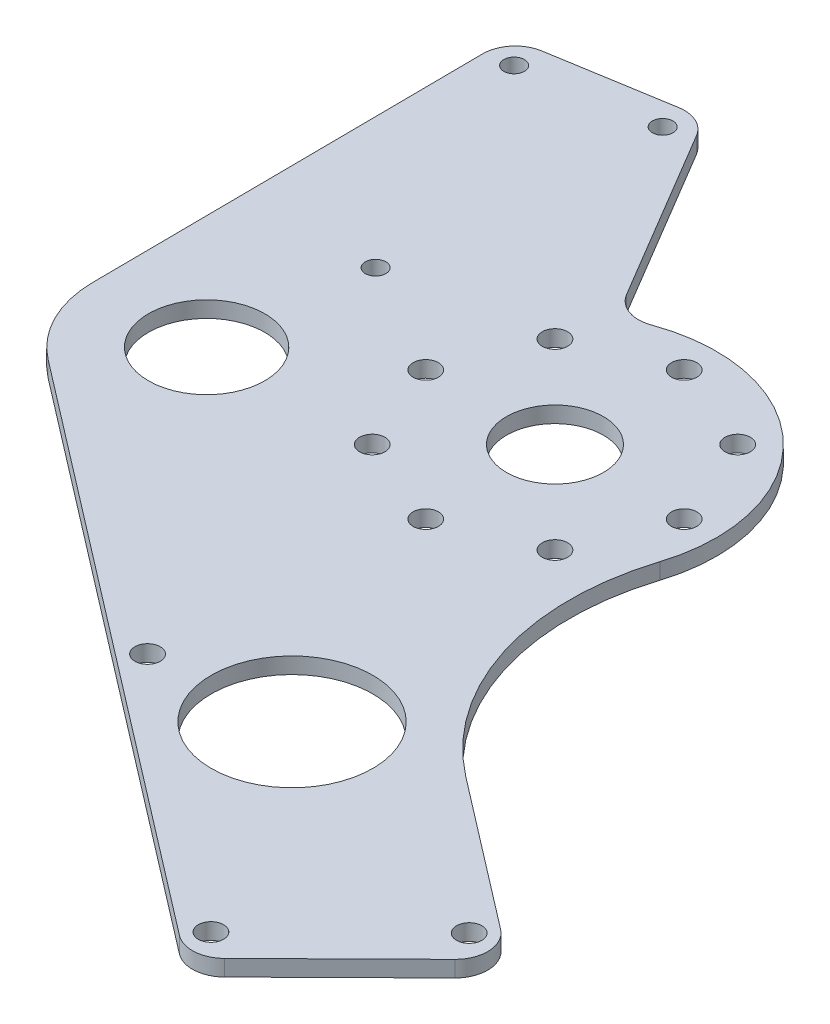
ISO-10303-21;
HEADER;
FILE_DESCRIPTION(('STEP AP214'),'2;1');
FILE_NAME('part.step','',(''),(''),'','','');
FILE_SCHEMA(('AUTOMOTIVE_DESIGN { 1 0 10303 214 1 1 1 1 }'));
ENDSEC;
DATA;
#1=APPLICATION_CONTEXT('core data for automotive mechanical design processes');
#2=APPLICATION_PROTOCOL_DEFINITION('international standard','automotive_design',2000,#1);
#3=PRODUCT_CONTEXT('',#1,'mechanical');
#4=PRODUCT('Part','Part','',(#3));
#5=PRODUCT_RELATED_PRODUCT_CATEGORY('part','',(#4));
#6=PRODUCT_DEFINITION_FORMATION('','',#4);
#7=PRODUCT_DEFINITION_CONTEXT('part definition',#1,'design');
#8=PRODUCT_DEFINITION('design','',#6,#7);
#9=PRODUCT_DEFINITION_SHAPE('','',#8);
#10=(LENGTH_UNIT() NAMED_UNIT(*) SI_UNIT(.MILLI.,.METRE.));
#11=(NAMED_UNIT(*) PLANE_ANGLE_UNIT() SI_UNIT($,.RADIAN.));
#12=(NAMED_UNIT(*) SI_UNIT($,.STERADIAN.) SOLID_ANGLE_UNIT());
#13=UNCERTAINTY_MEASURE_WITH_UNIT(LENGTH_MEASURE(1.E-05),#10,'distance_accuracy_value','');
#14=(GEOMETRIC_REPRESENTATION_CONTEXT(3) GLOBAL_UNCERTAINTY_ASSIGNED_CONTEXT((#13)) GLOBAL_UNIT_ASSIGNED_CONTEXT((#10,
#11,#12)) REPRESENTATION_CONTEXT('',''));
#15=CARTESIAN_POINT('',(0.,0.,0.));
#16=DIRECTION('',(0.,0.,1.));
#17=DIRECTION('',(1.,0.,0.));
#18=AXIS2_PLACEMENT_3D('',#15,#16,#17);
#19=CARTESIAN_POINT('',(418.465604345526,3.175,-3.2339030735739));
#20=DIRECTION('',(-0.999970140329143,0.,0.00772777135494843));
#21=DIRECTION('',(0.00772777135494843,0.,0.999970140329143));
#22=AXIS2_PLACEMENT_3D('',#19,#20,#21);
#23=PLANE('',#22);
#24=DIRECTION('',(-0.00772777135494843,0.,-0.999970140329143));
#25=VECTOR('',#24,1.);
#26=CARTESIAN_POINT('',(418.465604345526,0.,-3.2339030735739));
#27=LINE('',#26,#25);
#28=CARTESIAN_POINT('',(408.5011770715,0.,-1292.62631413742));
#29=VERTEX_POINT('',#28);
#30=CARTESIAN_POINT('',(407.904226499624,0.,-1369.87144985773));
#31=VERTEX_POINT('',#30);
#32=EDGE_CURVE('E145',#29,#31,#27,.T.);
#33=ORIENTED_EDGE('',*,*,#32,.F.);
#34=DIRECTION('',(0.,-1.,0.));
#35=VECTOR('',#34,1.);
#36=CARTESIAN_POINT('',(408.5011770715,3.175,-1292.62631413742));
#37=LINE('',#36,#35);
#38=CARTESIAN_POINT('',(408.5011770715,3.175,-1292.62631413742));
#39=VERTEX_POINT('',#38);
#40=EDGE_CURVE('E140',#39,#29,#37,.T.);
#41=ORIENTED_EDGE('',*,*,#40,.F.);
#42=DIRECTION('',(-0.00772777135494843,0.,-0.999970140329143));
#43=VECTOR('',#42,1.);
#44=CARTESIAN_POINT('',(418.465604345526,3.175,-3.2339030735739));
#45=LINE('',#44,#43);
#46=CARTESIAN_POINT('',(407.904226499624,3.175,-1369.87144985773));
#47=VERTEX_POINT('',#46);
#48=EDGE_CURVE('E143',#39,#47,#45,.T.);
#49=ORIENTED_EDGE('',*,*,#48,.T.);
#50=DIRECTION('',(0.,-1.,0.));
#51=VECTOR('',#50,1.);
#52=CARTESIAN_POINT('',(407.904226499624,3.175,-1369.87144985773));
#53=LINE('',#52,#51);
#54=EDGE_CURVE('E240',#47,#31,#53,.T.);
#55=ORIENTED_EDGE('',*,*,#54,.T.);
#56=EDGE_LOOP('',(#33,#41,#49,#55));
#57=FACE_BOUND('',#56,.T.);
#58=ADVANCED_FACE('F37',(#57),#23,.T.);
#59=CARTESIAN_POINT('',(430.725513440315,3.175,-1292.79806385579));
#60=DIRECTION('',(0.,-1.,0.));
#61=DIRECTION('',(0.,0.,-1.));
#62=AXIS2_PLACEMENT_3D('',#59,#60,#61);
#63=CYLINDRICAL_SURFACE('',#62,22.2249999999998);
#64=CARTESIAN_POINT('',(430.725513440315,0.,-1292.79806385579));
#65=DIRECTION('',(0.,1.,0.));
#66=DIRECTION('',(0.,0.,1.));
#67=AXIS2_PLACEMENT_3D('',#64,#65,#66);
#68=CIRCLE('',#67,22.2249999999998);
#69=CARTESIAN_POINT('',(417.195790680597,0.,-1275.16578586781));
#70=VERTEX_POINT('',#69);
#71=EDGE_CURVE('E242',#29,#70,#68,.T.);
#72=ORIENTED_EDGE('',*,*,#71,.T.);
#73=DIRECTION('',(0.,-1.,0.));
#74=VECTOR('',#73,1.);
#75=CARTESIAN_POINT('',(417.195790680597,3.175,-1275.16578586781));
#76=LINE('',#75,#74);
#77=CARTESIAN_POINT('',(417.195790680597,3.175,-1275.16578586781));
#78=VERTEX_POINT('',#77);
#79=EDGE_CURVE('E149',#78,#70,#76,.T.);
#80=ORIENTED_EDGE('',*,*,#79,.F.);
#81=CARTESIAN_POINT('',(430.725513440315,3.175,-1292.79806385579));
#82=DIRECTION('',(0.,1.,0.));
#83=DIRECTION('',(0.,0.,1.));
#84=AXIS2_PLACEMENT_3D('',#81,#82,#83);
#85=CIRCLE('',#84,22.2249999999998);
#86=EDGE_CURVE('E152',#39,#78,#85,.T.);
#87=ORIENTED_EDGE('',*,*,#86,.F.);
#88=ORIENTED_EDGE('',*,*,#40,.T.);
#89=EDGE_LOOP('',(#72,#80,#87,#88));
#90=FACE_BOUND('',#89,.T.);
#91=ADVANCED_FACE('F153',(#90),#63,.T.);
#92=CARTESIAN_POINT('',(770.466569942881,3.175,-1004.09158287551));
#93=DIRECTION('',(0.608761429008716,0.,-0.793353340291239));
#94=DIRECTION('',(-0.793353340291239,0.,-0.608761429008716));
#95=AXIS2_PLACEMENT_3D('',#92,#93,#94);
#96=PLANE('',#95);
#97=DIRECTION('',(0.793353340291239,0.,0.608761429008716));
#98=VECTOR('',#97,1.);
#99=CARTESIAN_POINT('',(770.466569942881,0.,-1004.09158287551));
#100=LINE('',#99,#98);
#101=CARTESIAN_POINT('',(528.200725869767,0.,-1189.98870329831));
#102=VERTEX_POINT('',#101);
#103=EDGE_CURVE('E245',#70,#102,#100,.T.);
#104=ORIENTED_EDGE('',*,*,#103,.T.);
#105=DIRECTION('',(0.,-1.,0.));
#106=VECTOR('',#105,1.);
#107=CARTESIAN_POINT('',(528.200725869767,3.175,-1189.98870329831));
#108=LINE('',#107,#106);
#109=CARTESIAN_POINT('',(528.200725869767,3.175,-1189.98870329831));
#110=VERTEX_POINT('',#109);
#111=EDGE_CURVE('E52',#102,#110,#108,.F.);
#112=ORIENTED_EDGE('',*,*,#111,.T.);
#113=DIRECTION('',(0.793353340291239,0.,0.608761429008716));
#114=VECTOR('',#113,1.);
#115=CARTESIAN_POINT('',(770.466569942881,3.175,-1004.09158287551));
#116=LINE('',#115,#114);
#117=EDGE_CURVE('E155',#78,#110,#116,.T.);
#118=ORIENTED_EDGE('',*,*,#117,.F.);
#119=ORIENTED_EDGE('',*,*,#79,.T.);
#120=EDGE_LOOP('',(#104,#112,#118,#119));
#121=FACE_BOUND('',#120,.T.);
#122=ADVANCED_FACE('F377',(#121),#96,.F.);
#123=CARTESIAN_POINT('',(-330.714425739165,3.175,-335.412196398918));
#124=DIRECTION('',(0.702102543692192,0.,0.712075851395729));
#125=DIRECTION('',(0.712075851395729,0.,-0.702102543692192));
#126=AXIS2_PLACEMENT_3D('',#123,#124,#125);
#127=PLANE('',#126);
#128=DIRECTION('',(-0.712075851395729,0.,0.702102543692193));
#129=VECTOR('',#128,1.);
#130=CARTESIAN_POINT('',(-330.714425739165,0.,-335.412196398918));
#131=LINE('',#130,#129);
#132=CARTESIAN_POINT('',(559.349966892476,0.,-1213.01038048511));
#133=VERTEX_POINT('',#132);
#134=CARTESIAN_POINT('',(536.524712096418,0.,-1190.5048153528));
#135=VERTEX_POINT('',#134);
#136=EDGE_CURVE('E247',#133,#135,#131,.T.);
#137=ORIENTED_EDGE('',*,*,#136,.F.);
#138=DIRECTION('',(0.,-1.,0.));
#139=VECTOR('',#138,1.);
#140=CARTESIAN_POINT('',(559.349966892476,3.175,-1213.01038048511));
#141=LINE('',#140,#139);
#142=CARTESIAN_POINT('',(559.349966892476,3.175,-1213.01038048511));
#143=VERTEX_POINT('',#142);
#144=EDGE_CURVE('E341',#133,#143,#141,.F.);
#145=ORIENTED_EDGE('',*,*,#144,.T.);
#146=DIRECTION('',(-0.712075851395729,0.,0.702102543692193));
#147=VECTOR('',#146,1.);
#148=CARTESIAN_POINT('',(-330.714425739165,3.175,-335.412196398918));
#149=LINE('',#148,#147);
#150=CARTESIAN_POINT('',(536.524712096418,3.175,-1190.5048153528));
#151=VERTEX_POINT('',#150);
#152=EDGE_CURVE('E173',#143,#151,#149,.T.);
#153=ORIENTED_EDGE('',*,*,#152,.T.);
#154=DIRECTION('',(0.,-1.,0.));
#155=VECTOR('',#154,1.);
#156=CARTESIAN_POINT('',(536.524712096418,0.,-1190.5048153528));
#157=LINE('',#156,#155);
#158=EDGE_CURVE('E338',#151,#135,#157,.T.);
#159=ORIENTED_EDGE('',*,*,#158,.T.);
#160=EDGE_LOOP('',(#137,#145,#153,#159));
#161=FACE_BOUND('',#160,.T.);
#162=ADVANCED_FACE('F382',(#161),#127,.T.);
#163=CARTESIAN_POINT('',(797.52601546232,3.175,-1039.35613885145));
#164=DIRECTION('',(-0.608761429008717,0.,0.793353340291238));
#165=DIRECTION('',(0.793353340291238,0.,0.608761429008717));
#166=AXIS2_PLACEMENT_3D('',#163,#164,#165);
#167=PLANE('',#166);
#168=DIRECTION('',(-0.793353340291238,0.,-0.608761429008717));
#169=VECTOR('',#168,1.);
#170=CARTESIAN_POINT('',(797.52601546232,3.175,-1039.35613885145));
#171=LINE('',#170,#169);
#172=CARTESIAN_POINT('',(558.757250814236,3.175,-1222.56985585232));
#173=VERTEX_POINT('',#172);
#174=CARTESIAN_POINT('',(529.278223979337,3.175,-1245.1899087221));
#175=VERTEX_POINT('',#174);
#176=EDGE_CURVE('E175',#173,#175,#171,.T.);
#177=ORIENTED_EDGE('',*,*,#176,.F.);
#178=DIRECTION('',(0.,-1.,0.));
#179=VECTOR('',#178,1.);
#180=CARTESIAN_POINT('',(558.757250814236,0.,-1222.56985585232));
#181=LINE('',#180,#179);
#182=CARTESIAN_POINT('',(558.757250814236,0.,-1222.56985585232));
#183=VERTEX_POINT('',#182);
#184=EDGE_CURVE('E331',#173,#183,#181,.T.);
#185=ORIENTED_EDGE('',*,*,#184,.T.);
#186=DIRECTION('',(-0.793353340291238,0.,-0.608761429008717));
#187=VECTOR('',#186,1.);
#188=CARTESIAN_POINT('',(797.52601546232,0.,-1039.35613885145));
#189=LINE('',#188,#187);
#190=CARTESIAN_POINT('',(529.278223979337,0.,-1245.1899087221));
#191=VERTEX_POINT('',#190);
#192=EDGE_CURVE('E250',#183,#191,#189,.T.);
#193=ORIENTED_EDGE('',*,*,#192,.T.);
#194=DIRECTION('',(0.,-1.,0.));
#195=VECTOR('',#194,1.);
#196=CARTESIAN_POINT('',(529.278223979337,3.175,-1245.1899087221));
#197=LINE('',#196,#195);
#198=EDGE_CURVE('E323',#175,#191,#197,.T.);
#199=ORIENTED_EDGE('',*,*,#198,.F.);
#200=EDGE_LOOP('',(#177,#185,#193,#199));
#201=FACE_BOUND('',#200,.T.);
#202=ADVANCED_FACE('F390',(#201),#167,.F.);
#203=CARTESIAN_POINT('',(560.20330457298,3.175,-1285.49225840889));
#204=DIRECTION('',(0.,-1.,0.));
#205=DIRECTION('',(0.,0.,-1.));
#206=AXIS2_PLACEMENT_3D('',#203,#204,#205);
#207=CYLINDRICAL_SURFACE('',#206,50.8);
#208=CARTESIAN_POINT('',(560.20330457298,0.,-1285.49225840889));
#209=DIRECTION('',(0.,1.,0.));
#210=DIRECTION('',(0.,0.,1.));
#211=AXIS2_PLACEMENT_3D('',#208,#209,#210);
#212=CIRCLE('',#211,50.8);
#213=CARTESIAN_POINT('',(511.786202337494,0.,-1300.86835060159));
#214=VERTEX_POINT('',#213);
#215=EDGE_CURVE('E252',#214,#191,#212,.T.);
#216=ORIENTED_EDGE('',*,*,#215,.F.);
#217=DIRECTION('',(0.,-1.,0.));
#218=VECTOR('',#217,1.);
#219=CARTESIAN_POINT('',(511.786202337494,3.175,-1300.86835060159));
#220=LINE('',#219,#218);
#221=CARTESIAN_POINT('',(511.786202337494,3.175,-1300.86835060159));
#222=VERTEX_POINT('',#221);
#223=EDGE_CURVE('E321',#222,#214,#220,.T.);
#224=ORIENTED_EDGE('',*,*,#223,.F.);
#225=CARTESIAN_POINT('',(560.20330457298,3.175,-1285.49225840889));
#226=DIRECTION('',(0.,1.,0.));
#227=DIRECTION('',(0.,0.,1.));
#228=AXIS2_PLACEMENT_3D('',#225,#226,#227);
#229=CIRCLE('',#228,50.8);
#230=EDGE_CURVE('E177',#222,#175,#229,.T.);
#231=ORIENTED_EDGE('',*,*,#230,.T.);
#232=ORIENTED_EDGE('',*,*,#198,.T.);
#233=EDGE_LOOP('',(#216,#224,#231,#232));
#234=FACE_BOUND('',#233,.T.);
#235=ADVANCED_FACE('F393',(#234),#207,.F.);
#236=CARTESIAN_POINT('',(481.525513440315,3.175,-1310.47840822203));
#237=DIRECTION('',(0.,-1.,0.));
#238=DIRECTION('',(0.,0.,-1.));
#239=AXIS2_PLACEMENT_3D('',#236,#237,#238);
#240=CYLINDRICAL_SURFACE('',#239,31.75);
#241=CARTESIAN_POINT('',(481.525513440315,0.,-1310.47840822203));
#242=DIRECTION('',(0.,1.,0.));
#243=DIRECTION('',(0.,0.,1.));
#244=AXIS2_PLACEMENT_3D('',#241,#242,#243);
#245=CIRCLE('',#244,31.75);
#246=CARTESIAN_POINT('',(470.66528430172,0.,-1340.31325233185));
#247=VERTEX_POINT('',#246);
#248=EDGE_CURVE('E255',#214,#247,#245,.T.);
#249=ORIENTED_EDGE('',*,*,#248,.T.);
#250=DIRECTION('',(0.,-1.,0.));
#251=VECTOR('',#250,1.);
#252=CARTESIAN_POINT('',(470.66528430172,3.175,-1340.31325233185));
#253=LINE('',#252,#251);
#254=CARTESIAN_POINT('',(470.66528430172,3.175,-1340.31325233185));
#255=VERTEX_POINT('',#254);
#256=EDGE_CURVE('E329',#247,#255,#253,.F.);
#257=ORIENTED_EDGE('',*,*,#256,.T.);
#258=CARTESIAN_POINT('',(481.525513440315,3.175,-1310.47840822203));
#259=DIRECTION('',(0.,1.,0.));
#260=DIRECTION('',(0.,0.,1.));
#261=AXIS2_PLACEMENT_3D('',#258,#259,#260);
#262=CIRCLE('',#261,31.75);
#263=EDGE_CURVE('E180',#222,#255,#262,.T.);
#264=ORIENTED_EDGE('',*,*,#263,.F.);
#265=ORIENTED_EDGE('',*,*,#223,.T.);
#266=EDGE_LOOP('',(#249,#257,#264,#265));
#267=FACE_BOUND('',#266,.T.);
#268=ADVANCED_FACE('F358',(#267),#240,.T.);
#269=CARTESIAN_POINT('',(932.069584050088,3.175,-554.201701845273));
#270=DIRECTION('',(0.859536631227861,0.,-0.5110741429357));
#271=DIRECTION('',(-0.5110741429357,0.,-0.859536631227861));
#272=AXIS2_PLACEMENT_3D('',#269,#270,#271);
#273=PLANE('',#272);
#274=DIRECTION('',(0.5110741429357,0.,0.859536631227861));
#275=VECTOR('',#274,1.);
#276=CARTESIAN_POINT('',(932.069584050088,3.175,-554.201701845273));
#277=LINE('',#276,#275);
#278=CARTESIAN_POINT('',(442.845023811934,3.175,-1376.99118598073));
#279=VERTEX_POINT('',#278);
#280=CARTESIAN_POINT('',(463.035180865704,3.175,-1343.03490034618));
#281=VERTEX_POINT('',#280);
#282=EDGE_CURVE('E183',#279,#281,#277,.T.);
#283=ORIENTED_EDGE('',*,*,#282,.T.);
#284=DIRECTION('',(0.,-1.,0.));
#285=VECTOR('',#284,1.);
#286=CARTESIAN_POINT('',(463.035180865704,3.175,-1343.03490034617));
#287=LINE('',#286,#285);
#288=CARTESIAN_POINT('',(463.035180865704,0.,-1343.03490034618));
#289=VERTEX_POINT('',#288);
#290=EDGE_CURVE('E148',#281,#289,#287,.T.);
#291=ORIENTED_EDGE('',*,*,#290,.T.);
#292=DIRECTION('',(0.5110741429357,0.,0.859536631227861));
#293=VECTOR('',#292,1.);
#294=CARTESIAN_POINT('',(932.069584050088,0.,-554.201701845273));
#295=LINE('',#294,#293);
#296=CARTESIAN_POINT('',(442.845023811934,0.,-1376.99118598073));
#297=VERTEX_POINT('',#296);
#298=EDGE_CURVE('E258',#297,#289,#295,.T.);
#299=ORIENTED_EDGE('',*,*,#298,.F.);
#300=DIRECTION('',(0.,-1.,0.));
#301=VECTOR('',#300,1.);
#302=CARTESIAN_POINT('',(442.845023811934,3.175,-1376.99118598073));
#303=LINE('',#302,#301);
#304=EDGE_CURVE('E319',#279,#297,#303,.T.);
#305=ORIENTED_EDGE('',*,*,#304,.F.);
#306=EDGE_LOOP('',(#283,#291,#299,#305));
#307=FACE_BOUND('',#306,.T.);
#308=ADVANCED_FACE('F365',(#307),#273,.T.);
#309=CARTESIAN_POINT('',(437.386966203637,3.175,-1373.74586517309));
#310=DIRECTION('',(0.,-1.,0.));
#311=DIRECTION('',(0.,0.,-1.));
#312=AXIS2_PLACEMENT_3D('',#309,#310,#311);
#313=CYLINDRICAL_SURFACE('',#312,6.35000000000016);
#314=CARTESIAN_POINT('',(437.386966203637,0.,-1373.74586517309));
#315=DIRECTION('',(0.,1.,0.));
#316=DIRECTION('',(0.,0.,1.));
#317=AXIS2_PLACEMENT_3D('',#314,#315,#316);
#318=CIRCLE('',#317,6.35000000000016);
#319=CARTESIAN_POINT('',(436.350976576713,0.,-1380.01078540346));
#320=VERTEX_POINT('',#319);
#321=EDGE_CURVE('E261',#297,#320,#318,.T.);
#322=ORIENTED_EDGE('',*,*,#321,.T.);
#323=DIRECTION('',(0.,-1.,0.));
#324=VECTOR('',#323,1.);
#325=CARTESIAN_POINT('',(436.350976576713,3.175,-1380.01078540346));
#326=LINE('',#325,#324);
#327=CARTESIAN_POINT('',(436.350976576713,3.175,-1380.01078540346));
#328=VERTEX_POINT('',#327);
#329=EDGE_CURVE('E317',#328,#320,#326,.T.);
#330=ORIENTED_EDGE('',*,*,#329,.F.);
#331=CARTESIAN_POINT('',(437.386966203637,3.175,-1373.74586517309));
#332=DIRECTION('',(0.,1.,0.));
#333=DIRECTION('',(0.,0.,1.));
#334=AXIS2_PLACEMENT_3D('',#331,#332,#333);
#335=CIRCLE('',#334,6.35000000000016);
#336=EDGE_CURVE('E186',#279,#328,#335,.T.);
#337=ORIENTED_EDGE('',*,*,#336,.F.);
#338=ORIENTED_EDGE('',*,*,#304,.T.);
#339=EDGE_LOOP('',(#322,#330,#337,#338));
#340=FACE_BOUND('',#339,.T.);
#341=ADVANCED_FACE('F369',(#340),#313,.T.);
#342=CARTESIAN_POINT('',(-210.514901005292,3.175,-1273.04272922023));
#343=DIRECTION('',(-0.163147972743856,0.,-0.986601611081986));
#344=DIRECTION('',(-0.986601611081986,0.,0.163147972743856));
#345=AXIS2_PLACEMENT_3D('',#342,#343,#344);
#346=PLANE('',#345);
#347=DIRECTION('',(0.986601611081986,0.,-0.163147972743856));
#348=VECTOR('',#347,1.);
#349=CARTESIAN_POINT('',(-210.514901005292,0.,-1273.04272922023));
#350=LINE('',#349,#348);
#351=CARTESIAN_POINT('',(413.218047263791,0.,-1376.18544143621));
#352=VERTEX_POINT('',#351);
#353=EDGE_CURVE('E264',#352,#320,#350,.T.);
#354=ORIENTED_EDGE('',*,*,#353,.F.);
#355=DIRECTION('',(0.,-1.,0.));
#356=VECTOR('',#355,1.);
#357=CARTESIAN_POINT('',(413.218047263791,3.175,-1376.18544143621));
#358=LINE('',#357,#356);
#359=CARTESIAN_POINT('',(413.218047263791,3.175,-1376.18544143621));
#360=VERTEX_POINT('',#359);
#361=EDGE_CURVE('E315',#360,#352,#358,.T.);
#362=ORIENTED_EDGE('',*,*,#361,.F.);
#363=DIRECTION('',(0.986601611081986,0.,-0.163147972743856));
#364=VECTOR('',#363,1.);
#365=CARTESIAN_POINT('',(-210.514901005292,3.175,-1273.04272922023));
#366=LINE('',#365,#364);
#367=EDGE_CURVE('E188',#360,#328,#366,.T.);
#368=ORIENTED_EDGE('',*,*,#367,.T.);
#369=ORIENTED_EDGE('',*,*,#329,.T.);
#370=EDGE_LOOP('',(#354,#362,#368,#369));
#371=FACE_BOUND('',#370,.T.);
#372=ADVANCED_FACE('F372',(#371),#346,.T.);
#373=CARTESIAN_POINT('',(556.261131027794,3.175,-1218.88239604941));
#374=DIRECTION('',(0.,-1.,0.));
#375=DIRECTION('',(0.,0.,-1.));
#376=AXIS2_PLACEMENT_3D('',#373,#374,#375);
#377=CYLINDRICAL_SURFACE('',#376,2.48919999999997);
#378=CARTESIAN_POINT('',(556.261131027794,3.175,-1218.88239604941));
#379=DIRECTION('',(0.,1.,0.));
#380=DIRECTION('',(0.,0.,1.));
#381=AXIS2_PLACEMENT_3D('',#378,#379,#380);
#382=CIRCLE('',#381,2.48919999999997);
#383=CARTESIAN_POINT('',(556.261131027794,3.175,-1216.39319604941));
#384=VERTEX_POINT('',#383);
#385=EDGE_CURVE('E234',#384,#384,#382,.T.);
#386=ORIENTED_EDGE('',*,*,#385,.T.);
#387=EDGE_LOOP('',(#386));
#388=FACE_BOUND('',#387,.T.);
#389=CARTESIAN_POINT('',(556.261131027794,0.,-1218.88239604941));
#390=DIRECTION('',(0.,1.,0.));
#391=DIRECTION('',(0.,0.,1.));
#392=AXIS2_PLACEMENT_3D('',#389,#390,#391);
#393=CIRCLE('',#392,2.48919999999997);
#394=CARTESIAN_POINT('',(556.261131027794,0.,-1216.39319604941));
#395=VERTEX_POINT('',#394);
#396=EDGE_CURVE('E166',#395,#395,#393,.T.);
#397=ORIENTED_EDGE('',*,*,#396,.F.);
#398=EDGE_LOOP('',(#397));
#399=FACE_BOUND('',#398,.T.);
#400=ADVANCED_FACE('F436',(#388,#399),#377,.F.);
#401=CARTESIAN_POINT('',(477.144066858597,3.175,-1234.76865555389));
#402=DIRECTION('',(0.,-1.,0.));
#403=DIRECTION('',(0.,0.,-1.));
#404=AXIS2_PLACEMENT_3D('',#401,#402,#403);
#405=CYLINDRICAL_SURFACE('',#404,2.48920000000002);
#406=CARTESIAN_POINT('',(477.144066858597,3.175,-1234.76865555389));
#407=DIRECTION('',(0.,1.,0.));
#408=DIRECTION('',(0.,0.,1.));
#409=AXIS2_PLACEMENT_3D('',#406,#407,#408);
#410=CIRCLE('',#409,2.48920000000002);
#411=CARTESIAN_POINT('',(477.144066858597,3.175,-1232.27945555389));
#412=VERTEX_POINT('',#411);
#413=EDGE_CURVE('E231',#412,#412,#410,.T.);
#414=ORIENTED_EDGE('',*,*,#413,.T.);
#415=EDGE_LOOP('',(#414));
#416=FACE_BOUND('',#415,.T.);
#417=CARTESIAN_POINT('',(477.144066858597,0.,-1234.76865555389));
#418=DIRECTION('',(0.,1.,0.));
#419=DIRECTION('',(0.,0.,1.));
#420=AXIS2_PLACEMENT_3D('',#417,#418,#419);
#421=CIRCLE('',#420,2.48920000000002);
#422=CARTESIAN_POINT('',(477.144066858597,0.,-1232.27945555389));
#423=VERTEX_POINT('',#422);
#424=EDGE_CURVE('E309',#423,#423,#421,.T.);
#425=ORIENTED_EDGE('',*,*,#424,.F.);
#426=EDGE_LOOP('',(#425));
#427=FACE_BOUND('',#426,.T.);
#428=ADVANCED_FACE('F439',(#416,#427),#405,.F.);
#429=CARTESIAN_POINT('',(502.892129115102,3.175,-1237.42267201742));
#430=DIRECTION('',(0.,-1.,0.));
#431=DIRECTION('',(0.,0.,-1.));
#432=AXIS2_PLACEMENT_3D('',#429,#430,#431);
#433=CYLINDRICAL_SURFACE('',#432,15.875);
#434=CARTESIAN_POINT('',(502.892129115102,3.175,-1237.42267201742));
#435=DIRECTION('',(0.,1.,0.));
#436=DIRECTION('',(0.,0.,1.));
#437=AXIS2_PLACEMENT_3D('',#434,#435,#436);
#438=CIRCLE('',#437,15.875);
#439=CARTESIAN_POINT('',(502.892129115102,3.175,-1221.54767201742));
#440=VERTEX_POINT('',#439);
#441=EDGE_CURVE('E228',#440,#440,#438,.T.);
#442=ORIENTED_EDGE('',*,*,#441,.T.);
#443=EDGE_LOOP('',(#442));
#444=FACE_BOUND('',#443,.T.);
#445=CARTESIAN_POINT('',(502.892129115102,0.,-1237.42267201742));
#446=DIRECTION('',(0.,1.,0.));
#447=DIRECTION('',(0.,0.,1.));
#448=AXIS2_PLACEMENT_3D('',#445,#446,#447);
#449=CIRCLE('',#448,15.875);
#450=CARTESIAN_POINT('',(502.892129115102,0.,-1221.54767201742));
#451=VERTEX_POINT('',#450);
#452=EDGE_CURVE('E306',#451,#451,#449,.T.);
#453=ORIENTED_EDGE('',*,*,#452,.F.);
#454=EDGE_LOOP('',(#453));
#455=FACE_BOUND('',#454,.T.);
#456=ADVANCED_FACE('F443',(#444,#455),#433,.F.);
#457=CARTESIAN_POINT('',(430.725513440315,3.175,-1292.79806385579));
#458=DIRECTION('',(0.,-1.,0.));
#459=DIRECTION('',(0.,0.,-1.));
#460=AXIS2_PLACEMENT_3D('',#457,#458,#459);
#461=CYLINDRICAL_SURFACE('',#460,11.43);
#462=CARTESIAN_POINT('',(430.725513440315,3.175,-1292.79806385579));
#463=DIRECTION('',(0.,1.,0.));
#464=DIRECTION('',(0.,0.,1.));
#465=AXIS2_PLACEMENT_3D('',#462,#463,#464);
#466=CIRCLE('',#465,11.43);
#467=CARTESIAN_POINT('',(430.725513440315,3.175,-1281.36806385579));
#468=VERTEX_POINT('',#467);
#469=EDGE_CURVE('E225',#468,#468,#466,.T.);
#470=ORIENTED_EDGE('',*,*,#469,.T.);
#471=EDGE_LOOP('',(#470));
#472=FACE_BOUND('',#471,.T.);
#473=CARTESIAN_POINT('',(430.725513440315,0.,-1292.79806385579));
#474=DIRECTION('',(0.,1.,0.));
#475=DIRECTION('',(0.,0.,1.));
#476=AXIS2_PLACEMENT_3D('',#473,#474,#475);
#477=CIRCLE('',#476,11.43);
#478=CARTESIAN_POINT('',(430.725513440315,0.,-1281.36806385579));
#479=VERTEX_POINT('',#478);
#480=EDGE_CURVE('E303',#479,#479,#477,.T.);
#481=ORIENTED_EDGE('',*,*,#480,.F.);
#482=EDGE_LOOP('',(#481));
#483=FACE_BOUND('',#482,.T.);
#484=ADVANCED_FACE('F447',(#472,#483),#461,.F.);
#485=CARTESIAN_POINT('',(412.975684764623,3.175,-1370.99637536039));
#486=DIRECTION('',(0.,-1.,0.));
#487=DIRECTION('',(0.,0.,-1.));
#488=AXIS2_PLACEMENT_3D('',#485,#486,#487);
#489=CYLINDRICAL_SURFACE('',#488,2.01929999999989);
#490=CARTESIAN_POINT('',(412.975684764623,3.175,-1370.99637536039));
#491=DIRECTION('',(0.,1.,0.));
#492=DIRECTION('',(0.,0.,1.));
#493=AXIS2_PLACEMENT_3D('',#490,#491,#492);
#494=CIRCLE('',#493,2.01929999999989);
#495=CARTESIAN_POINT('',(412.975684764623,3.175,-1368.97707536039));
#496=VERTEX_POINT('',#495);
#497=EDGE_CURVE('E222',#496,#496,#494,.T.);
#498=ORIENTED_EDGE('',*,*,#497,.T.);
#499=EDGE_LOOP('',(#498));
#500=FACE_BOUND('',#499,.T.);
#501=CARTESIAN_POINT('',(412.975684764623,0.,-1370.99637536039));
#502=DIRECTION('',(0.,1.,0.));
#503=DIRECTION('',(0.,0.,1.));
#504=AXIS2_PLACEMENT_3D('',#501,#502,#503);
#505=CIRCLE('',#504,2.01929999999989);
#506=CARTESIAN_POINT('',(412.975684764623,0.,-1368.97707536039));
#507=VERTEX_POINT('',#506);
#508=EDGE_CURVE('E300',#507,#507,#505,.T.);
#509=ORIENTED_EDGE('',*,*,#508,.F.);
#510=EDGE_LOOP('',(#509));
#511=FACE_BOUND('',#510,.T.);
#512=ADVANCED_FACE('F451',(#500,#511),#489,.F.);
#513=CARTESIAN_POINT('',(438.035365686105,3.175,-1375.14033386809));
#514=DIRECTION('',(0.,-1.,0.));
#515=DIRECTION('',(0.,0.,-1.));
#516=AXIS2_PLACEMENT_3D('',#513,#514,#515);
#517=CYLINDRICAL_SURFACE('',#516,2.01929999999989);
#518=CARTESIAN_POINT('',(438.035365686105,3.175,-1375.14033386809));
#519=DIRECTION('',(0.,1.,0.));
#520=DIRECTION('',(0.,0.,1.));
#521=AXIS2_PLACEMENT_3D('',#518,#519,#520);
#522=CIRCLE('',#521,2.01929999999989);
#523=CARTESIAN_POINT('',(438.035365686105,3.175,-1373.12103386809));
#524=VERTEX_POINT('',#523);
#525=EDGE_CURVE('E219',#524,#524,#522,.T.);
#526=ORIENTED_EDGE('',*,*,#525,.T.);
#527=EDGE_LOOP('',(#526));
#528=FACE_BOUND('',#527,.T.);
#529=CARTESIAN_POINT('',(438.035365686105,0.,-1375.14033386809));
#530=DIRECTION('',(0.,1.,0.));
#531=DIRECTION('',(0.,0.,1.));
#532=AXIS2_PLACEMENT_3D('',#529,#530,#531);
#533=CIRCLE('',#532,2.01929999999989);
#534=CARTESIAN_POINT('',(438.035365686105,0.,-1373.12103386809));
#535=VERTEX_POINT('',#534);
#536=EDGE_CURVE('E297',#535,#535,#533,.T.);
#537=ORIENTED_EDGE('',*,*,#536,.F.);
#538=EDGE_LOOP('',(#537));
#539=FACE_BOUND('',#538,.T.);
#540=ADVANCED_FACE('F455',(#528,#539),#517,.F.);
#541=CARTESIAN_POINT('',(463.565001198177,3.175,-1328.43892046417));
#542=DIRECTION('',(0.,-1.,0.));
#543=DIRECTION('',(0.,0.,-1.));
#544=AXIS2_PLACEMENT_3D('',#541,#542,#543);
#545=CYLINDRICAL_SURFACE('',#544,2.48919999999964);
#546=CARTESIAN_POINT('',(463.565001198177,3.175,-1328.43892046417));
#547=DIRECTION('',(0.,1.,0.));
#548=DIRECTION('',(0.,0.,1.));
#549=AXIS2_PLACEMENT_3D('',#546,#547,#548);
#550=CIRCLE('',#549,2.48919999999964);
#551=CARTESIAN_POINT('',(463.565001198177,3.175,-1325.94972046417));
#552=VERTEX_POINT('',#551);
#553=EDGE_CURVE('E216',#552,#552,#550,.T.);
#554=ORIENTED_EDGE('',*,*,#553,.T.);
#555=EDGE_LOOP('',(#554));
#556=FACE_BOUND('',#555,.T.);
#557=CARTESIAN_POINT('',(463.565001198177,0.,-1328.43892046417));
#558=DIRECTION('',(0.,1.,0.));
#559=DIRECTION('',(0.,0.,1.));
#560=AXIS2_PLACEMENT_3D('',#557,#558,#559);
#561=CIRCLE('',#560,2.48919999999964);
#562=CARTESIAN_POINT('',(463.565001198177,0.,-1325.94972046417));
#563=VERTEX_POINT('',#562);
#564=EDGE_CURVE('E294',#563,#563,#561,.T.);
#565=ORIENTED_EDGE('',*,*,#564,.F.);
#566=EDGE_LOOP('',(#565));
#567=FACE_BOUND('',#566,.T.);
#568=ADVANCED_FACE('F459',(#556,#567),#545,.F.);
#569=CARTESIAN_POINT('',(481.525513440315,3.175,-1335.87840822203));
#570=DIRECTION('',(0.,-1.,0.));
#571=DIRECTION('',(0.,0.,-1.));
#572=AXIS2_PLACEMENT_3D('',#569,#570,#571);
#573=CYLINDRICAL_SURFACE('',#572,2.48920000000008);
#574=CARTESIAN_POINT('',(481.525513440315,3.175,-1335.87840822203));
#575=DIRECTION('',(0.,1.,0.));
#576=DIRECTION('',(0.,0.,1.));
#577=AXIS2_PLACEMENT_3D('',#574,#575,#576);
#578=CIRCLE('',#577,2.48920000000008);
#579=CARTESIAN_POINT('',(481.525513440315,3.175,-1333.38920822203));
#580=VERTEX_POINT('',#579);
#581=EDGE_CURVE('E213',#580,#580,#578,.T.);
#582=ORIENTED_EDGE('',*,*,#581,.T.);
#583=EDGE_LOOP('',(#582));
#584=FACE_BOUND('',#583,.T.);
#585=CARTESIAN_POINT('',(481.525513440315,0.,-1335.87840822203));
#586=DIRECTION('',(0.,1.,0.));
#587=DIRECTION('',(0.,0.,1.));
#588=AXIS2_PLACEMENT_3D('',#585,#586,#587);
#589=CIRCLE('',#588,2.48920000000008);
#590=CARTESIAN_POINT('',(481.525513440315,0.,-1333.38920822203));
#591=VERTEX_POINT('',#590);
#592=EDGE_CURVE('E291',#591,#591,#589,.T.);
#593=ORIENTED_EDGE('',*,*,#592,.F.);
#594=EDGE_LOOP('',(#593));
#595=FACE_BOUND('',#594,.T.);
#596=ADVANCED_FACE('F463',(#584,#595),#573,.F.);
#597=CARTESIAN_POINT('',(499.486025682454,3.175,-1328.43892046417));
#598=DIRECTION('',(0.,-1.,0.));
#599=DIRECTION('',(0.,0.,-1.));
#600=AXIS2_PLACEMENT_3D('',#597,#598,#599);
#601=CYLINDRICAL_SURFACE('',#600,2.48920000000008);
#602=CARTESIAN_POINT('',(499.486025682454,3.175,-1328.43892046417));
#603=DIRECTION('',(0.,1.,0.));
#604=DIRECTION('',(0.,0.,1.));
#605=AXIS2_PLACEMENT_3D('',#602,#603,#604);
#606=CIRCLE('',#605,2.48920000000008);
#607=CARTESIAN_POINT('',(499.486025682454,3.175,-1325.94972046417));
#608=VERTEX_POINT('',#607);
#609=EDGE_CURVE('E210',#608,#608,#606,.T.);
#610=ORIENTED_EDGE('',*,*,#609,.T.);
#611=EDGE_LOOP('',(#610));
#612=FACE_BOUND('',#611,.T.);
#613=CARTESIAN_POINT('',(499.486025682454,0.,-1328.43892046417));
#614=DIRECTION('',(0.,1.,0.));
#615=DIRECTION('',(0.,0.,1.));
#616=AXIS2_PLACEMENT_3D('',#613,#614,#615);
#617=CIRCLE('',#616,2.48920000000008);
#618=CARTESIAN_POINT('',(499.486025682454,0.,-1325.94972046417));
#619=VERTEX_POINT('',#618);
#620=EDGE_CURVE('E288',#619,#619,#617,.T.);
#621=ORIENTED_EDGE('',*,*,#620,.F.);
#622=EDGE_LOOP('',(#621));
#623=FACE_BOUND('',#622,.T.);
#624=ADVANCED_FACE('F467',(#612,#623),#601,.F.);
#625=CARTESIAN_POINT('',(506.925513440316,3.175,-1310.47840822203));
#626=DIRECTION('',(0.,-1.,0.));
#627=DIRECTION('',(0.,0.,-1.));
#628=AXIS2_PLACEMENT_3D('',#625,#626,#627);
#629=CYLINDRICAL_SURFACE('',#628,2.48920000000008);
#630=CARTESIAN_POINT('',(506.925513440316,3.175,-1310.47840822203));
#631=DIRECTION('',(0.,1.,0.));
#632=DIRECTION('',(0.,0.,1.));
#633=AXIS2_PLACEMENT_3D('',#630,#631,#632);
#634=CIRCLE('',#633,2.48920000000008);
#635=CARTESIAN_POINT('',(506.925513440316,3.175,-1307.98920822203));
#636=VERTEX_POINT('',#635);
#637=EDGE_CURVE('E207',#636,#636,#634,.T.);
#638=ORIENTED_EDGE('',*,*,#637,.T.);
#639=EDGE_LOOP('',(#638));
#640=FACE_BOUND('',#639,.T.);
#641=CARTESIAN_POINT('',(506.925513440316,0.,-1310.47840822203));
#642=DIRECTION('',(0.,1.,0.));
#643=DIRECTION('',(0.,0.,1.));
#644=AXIS2_PLACEMENT_3D('',#641,#642,#643);
#645=CIRCLE('',#644,2.48920000000008);
#646=CARTESIAN_POINT('',(506.925513440316,0.,-1307.98920822203));
#647=VERTEX_POINT('',#646);
#648=EDGE_CURVE('E285',#647,#647,#645,.T.);
#649=ORIENTED_EDGE('',*,*,#648,.F.);
#650=EDGE_LOOP('',(#649));
#651=FACE_BOUND('',#650,.T.);
#652=ADVANCED_FACE('F471',(#640,#651),#629,.F.);
#653=CARTESIAN_POINT('',(499.486025682454,3.175,-1292.5178959799));
#654=DIRECTION('',(0.,-1.,0.));
#655=DIRECTION('',(0.,0.,-1.));
#656=AXIS2_PLACEMENT_3D('',#653,#654,#655);
#657=CYLINDRICAL_SURFACE('',#656,2.48920000000008);
#658=CARTESIAN_POINT('',(499.486025682454,3.175,-1292.5178959799));
#659=DIRECTION('',(0.,1.,0.));
#660=DIRECTION('',(0.,0.,1.));
#661=AXIS2_PLACEMENT_3D('',#658,#659,#660);
#662=CIRCLE('',#661,2.48920000000008);
#663=CARTESIAN_POINT('',(499.486025682454,3.175,-1290.0286959799));
#664=VERTEX_POINT('',#663);
#665=EDGE_CURVE('E204',#664,#664,#662,.T.);
#666=ORIENTED_EDGE('',*,*,#665,.T.);
#667=EDGE_LOOP('',(#666));
#668=FACE_BOUND('',#667,.T.);
#669=CARTESIAN_POINT('',(499.486025682454,0.,-1292.5178959799));
#670=DIRECTION('',(0.,1.,0.));
#671=DIRECTION('',(0.,0.,1.));
#672=AXIS2_PLACEMENT_3D('',#669,#670,#671);
#673=CIRCLE('',#672,2.48920000000008);
#674=CARTESIAN_POINT('',(499.486025682454,0.,-1290.0286959799));
#675=VERTEX_POINT('',#674);
#676=EDGE_CURVE('E282',#675,#675,#673,.T.);
#677=ORIENTED_EDGE('',*,*,#676,.F.);
#678=EDGE_LOOP('',(#677));
#679=FACE_BOUND('',#678,.T.);
#680=ADVANCED_FACE('F475',(#668,#679),#657,.F.);
#681=CARTESIAN_POINT('',(481.525513440315,3.175,-1285.07840822203));
#682=DIRECTION('',(0.,-1.,0.));
#683=DIRECTION('',(0.,0.,-1.));
#684=AXIS2_PLACEMENT_3D('',#681,#682,#683);
#685=CYLINDRICAL_SURFACE('',#684,2.48920000000008);
#686=CARTESIAN_POINT('',(481.525513440315,3.175,-1285.07840822203));
#687=DIRECTION('',(0.,1.,0.));
#688=DIRECTION('',(0.,0.,1.));
#689=AXIS2_PLACEMENT_3D('',#686,#687,#688);
#690=CIRCLE('',#689,2.48920000000008);
#691=CARTESIAN_POINT('',(481.525513440315,3.175,-1282.58920822203));
#692=VERTEX_POINT('',#691);
#693=EDGE_CURVE('E201',#692,#692,#690,.T.);
#694=ORIENTED_EDGE('',*,*,#693,.T.);
#695=EDGE_LOOP('',(#694));
#696=FACE_BOUND('',#695,.T.);
#697=CARTESIAN_POINT('',(481.525513440315,0.,-1285.07840822203));
#698=DIRECTION('',(0.,1.,0.));
#699=DIRECTION('',(0.,0.,1.));
#700=AXIS2_PLACEMENT_3D('',#697,#698,#699);
#701=CIRCLE('',#700,2.48920000000008);
#702=CARTESIAN_POINT('',(481.525513440315,0.,-1282.58920822203));
#703=VERTEX_POINT('',#702);
#704=EDGE_CURVE('E279',#703,#703,#701,.T.);
#705=ORIENTED_EDGE('',*,*,#704,.F.);
#706=EDGE_LOOP('',(#705));
#707=FACE_BOUND('',#706,.T.);
#708=ADVANCED_FACE('F479',(#696,#707),#685,.F.);
#709=CARTESIAN_POINT('',(463.565001198177,3.175,-1292.5178959799));
#710=DIRECTION('',(0.,-1.,0.));
#711=DIRECTION('',(0.,0.,-1.));
#712=AXIS2_PLACEMENT_3D('',#709,#710,#711);
#713=CYLINDRICAL_SURFACE('',#712,2.48920000000008);
#714=CARTESIAN_POINT('',(463.565001198177,3.175,-1292.5178959799));
#715=DIRECTION('',(0.,1.,0.));
#716=DIRECTION('',(0.,0.,1.));
#717=AXIS2_PLACEMENT_3D('',#714,#715,#716);
#718=CIRCLE('',#717,2.48920000000008);
#719=CARTESIAN_POINT('',(463.565001198177,3.175,-1290.0286959799));
#720=VERTEX_POINT('',#719);
#721=EDGE_CURVE('E198',#720,#720,#718,.T.);
#722=ORIENTED_EDGE('',*,*,#721,.T.);
#723=EDGE_LOOP('',(#722));
#724=FACE_BOUND('',#723,.T.);
#725=CARTESIAN_POINT('',(463.565001198177,0.,-1292.5178959799));
#726=DIRECTION('',(0.,1.,0.));
#727=DIRECTION('',(0.,0.,1.));
#728=AXIS2_PLACEMENT_3D('',#725,#726,#727);
#729=CIRCLE('',#728,2.48920000000008);
#730=CARTESIAN_POINT('',(463.565001198177,0.,-1290.0286959799));
#731=VERTEX_POINT('',#730);
#732=EDGE_CURVE('E276',#731,#731,#729,.T.);
#733=ORIENTED_EDGE('',*,*,#732,.F.);
#734=EDGE_LOOP('',(#733));
#735=FACE_BOUND('',#734,.T.);
#736=ADVANCED_FACE('F483',(#724,#735),#713,.F.);
#737=CARTESIAN_POINT('',(456.125513440315,3.175,-1310.47840822203));
#738=DIRECTION('',(0.,-1.,0.));
#739=DIRECTION('',(0.,0.,-1.));
#740=AXIS2_PLACEMENT_3D('',#737,#738,#739);
#741=CYLINDRICAL_SURFACE('',#740,2.48920000000008);
#742=CARTESIAN_POINT('',(456.125513440315,3.175,-1310.47840822203));
#743=DIRECTION('',(0.,1.,0.));
#744=DIRECTION('',(0.,0.,1.));
#745=AXIS2_PLACEMENT_3D('',#742,#743,#744);
#746=CIRCLE('',#745,2.48920000000008);
#747=CARTESIAN_POINT('',(456.125513440315,3.175,-1307.98920822203));
#748=VERTEX_POINT('',#747);
#749=EDGE_CURVE('E195',#748,#748,#746,.T.);
#750=ORIENTED_EDGE('',*,*,#749,.T.);
#751=EDGE_LOOP('',(#750));
#752=FACE_BOUND('',#751,.T.);
#753=CARTESIAN_POINT('',(456.125513440315,0.,-1310.47840822203));
#754=DIRECTION('',(0.,1.,0.));
#755=DIRECTION('',(0.,0.,1.));
#756=AXIS2_PLACEMENT_3D('',#753,#754,#755);
#757=CIRCLE('',#756,2.48920000000008);
#758=CARTESIAN_POINT('',(456.125513440315,0.,-1307.98920822203));
#759=VERTEX_POINT('',#758);
#760=EDGE_CURVE('E273',#759,#759,#757,.T.);
#761=ORIENTED_EDGE('',*,*,#760,.F.);
#762=EDGE_LOOP('',(#761));
#763=FACE_BOUND('',#762,.T.);
#764=ADVANCED_FACE('F487',(#752,#763),#741,.F.);
#765=CARTESIAN_POINT('',(433.793442240752,3.175,-1322.94899277128));
#766=DIRECTION('',(0.,-1.,0.));
#767=DIRECTION('',(0.,0.,-1.));
#768=AXIS2_PLACEMENT_3D('',#765,#766,#767);
#769=CYLINDRICAL_SURFACE('',#768,2.01929999999973);
#770=CARTESIAN_POINT('',(433.793442240752,3.175,-1322.94899277128));
#771=DIRECTION('',(0.,1.,0.));
#772=DIRECTION('',(0.,0.,1.));
#773=AXIS2_PLACEMENT_3D('',#770,#771,#772);
#774=CIRCLE('',#773,2.01929999999973);
#775=CARTESIAN_POINT('',(433.793442240752,3.175,-1320.92969277128));
#776=VERTEX_POINT('',#775);
#777=EDGE_CURVE('E192',#776,#776,#774,.T.);
#778=ORIENTED_EDGE('',*,*,#777,.T.);
#779=EDGE_LOOP('',(#778));
#780=FACE_BOUND('',#779,.T.);
#781=CARTESIAN_POINT('',(433.793442240752,0.,-1322.94899277128));
#782=DIRECTION('',(0.,1.,0.));
#783=DIRECTION('',(0.,0.,1.));
#784=AXIS2_PLACEMENT_3D('',#781,#782,#783);
#785=CIRCLE('',#784,2.01929999999973);
#786=CARTESIAN_POINT('',(433.793442240752,0.,-1320.92969277128));
#787=VERTEX_POINT('',#786);
#788=EDGE_CURVE('E270',#787,#787,#785,.T.);
#789=ORIENTED_EDGE('',*,*,#788,.F.);
#790=EDGE_LOOP('',(#789));
#791=FACE_BOUND('',#790,.T.);
#792=ADVANCED_FACE('F491',(#780,#791),#769,.F.);
#793=CARTESIAN_POINT('',(414.254036890715,3.175,-1369.92052120584));
#794=DIRECTION('',(0.,-1.,0.));
#795=DIRECTION('',(0.,0.,-1.));
#796=AXIS2_PLACEMENT_3D('',#793,#794,#795);
#797=CYLINDRICAL_SURFACE('',#796,6.35000000000021);
#798=CARTESIAN_POINT('',(414.254036890715,0.,-1369.92052120584));
#799=DIRECTION('',(0.,1.,0.));
#800=DIRECTION('',(0.,0.,1.));
#801=AXIS2_PLACEMENT_3D('',#798,#799,#800);
#802=CIRCLE('',#801,6.35000000000021);
#803=EDGE_CURVE('E267',#352,#31,#802,.T.);
#804=ORIENTED_EDGE('',*,*,#803,.T.);
#805=ORIENTED_EDGE('',*,*,#54,.F.);
#806=CARTESIAN_POINT('',(414.254036890715,3.175,-1369.92052120584));
#807=DIRECTION('',(0.,1.,0.));
#808=DIRECTION('',(0.,0.,1.));
#809=AXIS2_PLACEMENT_3D('',#806,#807,#808);
#810=CIRCLE('',#809,6.35000000000021);
#811=EDGE_CURVE('E161',#360,#47,#810,.T.);
#812=ORIENTED_EDGE('',*,*,#811,.F.);
#813=ORIENTED_EDGE('',*,*,#361,.T.);
#814=EDGE_LOOP('',(#804,#805,#812,#813));
#815=FACE_BOUND('',#814,.T.);
#816=ADVANCED_FACE('F375',(#815),#797,.T.);
#817=CARTESIAN_POINT('',(530.696845656209,3.175,-1193.67616310122));
#818=DIRECTION('',(0.,-1.,0.));
#819=DIRECTION('',(0.,0.,-1.));
#820=AXIS2_PLACEMENT_3D('',#817,#818,#819);
#821=CYLINDRICAL_SURFACE('',#820,2.48919999999997);
#822=CARTESIAN_POINT('',(530.696845656209,3.175,-1193.67616310122));
#823=DIRECTION('',(0.,1.,0.));
#824=DIRECTION('',(0.,0.,1.));
#825=AXIS2_PLACEMENT_3D('',#822,#823,#824);
#826=CIRCLE('',#825,2.48919999999997);
#827=CARTESIAN_POINT('',(530.696845656209,3.175,-1191.18696310122));
#828=VERTEX_POINT('',#827);
#829=EDGE_CURVE('E237',#828,#828,#826,.T.);
#830=ORIENTED_EDGE('',*,*,#829,.T.);
#831=EDGE_LOOP('',(#830));
#832=FACE_BOUND('',#831,.T.);
#833=CARTESIAN_POINT('',(530.696845656209,0.,-1193.67616310122));
#834=DIRECTION('',(0.,1.,0.));
#835=DIRECTION('',(0.,0.,1.));
#836=AXIS2_PLACEMENT_3D('',#833,#834,#835);
#837=CIRCLE('',#836,2.48919999999997);
#838=CARTESIAN_POINT('',(530.696845656209,0.,-1191.18696310122));
#839=VERTEX_POINT('',#838);
#840=EDGE_CURVE('E163',#839,#839,#837,.T.);
#841=ORIENTED_EDGE('',*,*,#840,.F.);
#842=EDGE_LOOP('',(#841));
#843=FACE_BOUND('',#842,.T.);
#844=ADVANCED_FACE('F428',(#832,#843),#821,.F.);
#845=CARTESIAN_POINT('',(0.,3.175,0.));
#846=DIRECTION('',(0.,1.,0.));
#847=DIRECTION('',(0.,0.,1.));
#848=AXIS2_PLACEMENT_3D('',#845,#846,#847);
#849=PLANE('',#848);
#850=CARTESIAN_POINT('',(481.525513440315,3.175,-1310.47840822203));
#851=DIRECTION('',(0.,1.,0.));
#852=DIRECTION('',(0.,0.,1.));
#853=AXIS2_PLACEMENT_3D('',#850,#851,#852);
#854=CIRCLE('',#853,9.52500000000005);
#855=CARTESIAN_POINT('',(481.525513440315,3.175,-1300.95340822203));
#856=VERTEX_POINT('',#855);
#857=EDGE_CURVE('E169',#856,#856,#854,.T.);
#858=ORIENTED_EDGE('',*,*,#857,.F.);
#859=EDGE_LOOP('',(#858));
#860=FACE_BOUND('',#859,.T.);
#861=ORIENTED_EDGE('',*,*,#152,.F.);
#862=CARTESIAN_POINT('',(554.89161574003,3.175,-1217.53206214147));
#863=DIRECTION('',(0.,1.,0.));
#864=DIRECTION('',(0.,0.,1.));
#865=AXIS2_PLACEMENT_3D('',#862,#863,#864);
#866=CIRCLE('',#865,6.35);
#867=EDGE_CURVE('E344',#143,#173,#866,.T.);
#868=ORIENTED_EDGE('',*,*,#867,.T.);
#869=ORIENTED_EDGE('',*,*,#176,.T.);
#870=ORIENTED_EDGE('',*,*,#230,.F.);
#871=ORIENTED_EDGE('',*,*,#263,.T.);
#872=CARTESIAN_POINT('',(468.493238474001,3.175,-1346.28022115382));
#873=DIRECTION('',(0.,1.,0.));
#874=DIRECTION('',(0.,0.,1.));
#875=AXIS2_PLACEMENT_3D('',#872,#873,#874);
#876=CIRCLE('',#875,6.35);
#877=EDGE_CURVE('E11',#255,#281,#876,.F.);
#878=ORIENTED_EDGE('',*,*,#877,.T.);
#879=ORIENTED_EDGE('',*,*,#282,.F.);
#880=ORIENTED_EDGE('',*,*,#336,.T.);
#881=ORIENTED_EDGE('',*,*,#367,.F.);
#882=ORIENTED_EDGE('',*,*,#811,.T.);
#883=ORIENTED_EDGE('',*,*,#48,.F.);
#884=ORIENTED_EDGE('',*,*,#86,.T.);
#885=ORIENTED_EDGE('',*,*,#117,.T.);
#886=CARTESIAN_POINT('',(532.066360943972,3.175,-1195.02649700916));
#887=DIRECTION('',(0.,1.,0.));
#888=DIRECTION('',(0.,0.,1.));
#889=AXIS2_PLACEMENT_3D('',#886,#887,#888);
#890=CIRCLE('',#889,6.35);
#891=EDGE_CURVE('E59',#110,#151,#890,.T.);
#892=ORIENTED_EDGE('',*,*,#891,.T.);
#893=EDGE_LOOP('',(#861,#868,#869,#870,#871,#878,#879,#880,#881,#882,#883,#884,#885,#892));
#894=FACE_BOUND('',#893,.T.);
#895=ORIENTED_EDGE('',*,*,#777,.F.);
#896=EDGE_LOOP('',(#895));
#897=FACE_BOUND('',#896,.T.);
#898=ORIENTED_EDGE('',*,*,#749,.F.);
#899=EDGE_LOOP('',(#898));
#900=FACE_BOUND('',#899,.T.);
#901=ORIENTED_EDGE('',*,*,#721,.F.);
#902=EDGE_LOOP('',(#901));
#903=FACE_BOUND('',#902,.T.);
#904=ORIENTED_EDGE('',*,*,#693,.F.);
#905=EDGE_LOOP('',(#904));
#906=FACE_BOUND('',#905,.T.);
#907=ORIENTED_EDGE('',*,*,#665,.F.);
#908=EDGE_LOOP('',(#907));
#909=FACE_BOUND('',#908,.T.);
#910=ORIENTED_EDGE('',*,*,#637,.F.);
#911=EDGE_LOOP('',(#910));
#912=FACE_BOUND('',#911,.T.);
#913=ORIENTED_EDGE('',*,*,#609,.F.);
#914=EDGE_LOOP('',(#913));
#915=FACE_BOUND('',#914,.T.);
#916=ORIENTED_EDGE('',*,*,#581,.F.);
#917=EDGE_LOOP('',(#916));
#918=FACE_BOUND('',#917,.T.);
#919=ORIENTED_EDGE('',*,*,#553,.F.);
#920=EDGE_LOOP('',(#919));
#921=FACE_BOUND('',#920,.T.);
#922=ORIENTED_EDGE('',*,*,#525,.F.);
#923=EDGE_LOOP('',(#922));
#924=FACE_BOUND('',#923,.T.);
#925=ORIENTED_EDGE('',*,*,#497,.F.);
#926=EDGE_LOOP('',(#925));
#927=FACE_BOUND('',#926,.T.);
#928=ORIENTED_EDGE('',*,*,#469,.F.);
#929=EDGE_LOOP('',(#928));
#930=FACE_BOUND('',#929,.T.);
#931=ORIENTED_EDGE('',*,*,#441,.F.);
#932=EDGE_LOOP('',(#931));
#933=FACE_BOUND('',#932,.T.);
#934=ORIENTED_EDGE('',*,*,#413,.F.);
#935=EDGE_LOOP('',(#934));
#936=FACE_BOUND('',#935,.T.);
#937=ORIENTED_EDGE('',*,*,#385,.F.);
#938=EDGE_LOOP('',(#937));
#939=FACE_BOUND('',#938,.T.);
#940=ORIENTED_EDGE('',*,*,#829,.F.);
#941=EDGE_LOOP('',(#940));
#942=FACE_BOUND('',#941,.T.);
#943=ADVANCED_FACE('F157',(#860,#894,#897,#900,#903,#906,#909,#912,#915,#918,#921,#924,#927,
#930,#933,#936,#939,#942),#849,.T.);
#944=CARTESIAN_POINT('',(0.,0.,0.));
#945=DIRECTION('',(0.,1.,0.));
#946=DIRECTION('',(0.,0.,1.));
#947=AXIS2_PLACEMENT_3D('',#944,#945,#946);
#948=PLANE('',#947);
#949=CARTESIAN_POINT('',(481.525513440315,0.,-1310.47840822203));
#950=DIRECTION('',(0.,1.,0.));
#951=DIRECTION('',(0.,0.,1.));
#952=AXIS2_PLACEMENT_3D('',#949,#950,#951);
#953=CIRCLE('',#952,9.52500000000005);
#954=CARTESIAN_POINT('',(481.525513440315,0.,-1300.95340822203));
#955=VERTEX_POINT('',#954);
#956=EDGE_CURVE('E243',#955,#955,#953,.T.);
#957=ORIENTED_EDGE('',*,*,#956,.T.);
#958=EDGE_LOOP('',(#957));
#959=FACE_BOUND('',#958,.T.);
#960=ORIENTED_EDGE('',*,*,#192,.F.);
#961=CARTESIAN_POINT('',(554.89161574003,0.,-1217.53206214147));
#962=DIRECTION('',(0.,1.,0.));
#963=DIRECTION('',(0.,0.,1.));
#964=AXIS2_PLACEMENT_3D('',#961,#962,#963);
#965=CIRCLE('',#964,6.35);
#966=EDGE_CURVE('E336',#183,#133,#965,.F.);
#967=ORIENTED_EDGE('',*,*,#966,.T.);
#968=ORIENTED_EDGE('',*,*,#136,.T.);
#969=CARTESIAN_POINT('',(532.066360943972,0.,-1195.02649700916));
#970=DIRECTION('',(0.,1.,0.));
#971=DIRECTION('',(0.,0.,1.));
#972=AXIS2_PLACEMENT_3D('',#969,#970,#971);
#973=CIRCLE('',#972,6.35);
#974=EDGE_CURVE('E334',#135,#102,#973,.F.);
#975=ORIENTED_EDGE('',*,*,#974,.T.);
#976=ORIENTED_EDGE('',*,*,#103,.F.);
#977=ORIENTED_EDGE('',*,*,#71,.F.);
#978=ORIENTED_EDGE('',*,*,#32,.T.);
#979=ORIENTED_EDGE('',*,*,#803,.F.);
#980=ORIENTED_EDGE('',*,*,#353,.T.);
#981=ORIENTED_EDGE('',*,*,#321,.F.);
#982=ORIENTED_EDGE('',*,*,#298,.T.);
#983=CARTESIAN_POINT('',(468.493238474001,0.,-1346.28022115382));
#984=DIRECTION('',(0.,1.,0.));
#985=DIRECTION('',(0.,0.,1.));
#986=AXIS2_PLACEMENT_3D('',#983,#984,#985);
#987=CIRCLE('',#986,6.35);
#988=EDGE_CURVE('E45',#289,#247,#987,.T.);
#989=ORIENTED_EDGE('',*,*,#988,.T.);
#990=ORIENTED_EDGE('',*,*,#248,.F.);
#991=ORIENTED_EDGE('',*,*,#215,.T.);
#992=EDGE_LOOP('',(#960,#967,#968,#975,#976,#977,#978,#979,#980,#981,#982,#989,#990,#991));
#993=FACE_BOUND('',#992,.T.);
#994=ORIENTED_EDGE('',*,*,#788,.T.);
#995=EDGE_LOOP('',(#994));
#996=FACE_BOUND('',#995,.T.);
#997=ORIENTED_EDGE('',*,*,#760,.T.);
#998=EDGE_LOOP('',(#997));
#999=FACE_BOUND('',#998,.T.);
#1000=ORIENTED_EDGE('',*,*,#732,.T.);
#1001=EDGE_LOOP('',(#1000));
#1002=FACE_BOUND('',#1001,.T.);
#1003=ORIENTED_EDGE('',*,*,#704,.T.);
#1004=EDGE_LOOP('',(#1003));
#1005=FACE_BOUND('',#1004,.T.);
#1006=ORIENTED_EDGE('',*,*,#676,.T.);
#1007=EDGE_LOOP('',(#1006));
#1008=FACE_BOUND('',#1007,.T.);
#1009=ORIENTED_EDGE('',*,*,#648,.T.);
#1010=EDGE_LOOP('',(#1009));
#1011=FACE_BOUND('',#1010,.T.);
#1012=ORIENTED_EDGE('',*,*,#620,.T.);
#1013=EDGE_LOOP('',(#1012));
#1014=FACE_BOUND('',#1013,.T.);
#1015=ORIENTED_EDGE('',*,*,#592,.T.);
#1016=EDGE_LOOP('',(#1015));
#1017=FACE_BOUND('',#1016,.T.);
#1018=ORIENTED_EDGE('',*,*,#564,.T.);
#1019=EDGE_LOOP('',(#1018));
#1020=FACE_BOUND('',#1019,.T.);
#1021=ORIENTED_EDGE('',*,*,#536,.T.);
#1022=EDGE_LOOP('',(#1021));
#1023=FACE_BOUND('',#1022,.T.);
#1024=ORIENTED_EDGE('',*,*,#508,.T.);
#1025=EDGE_LOOP('',(#1024));
#1026=FACE_BOUND('',#1025,.T.);
#1027=ORIENTED_EDGE('',*,*,#480,.T.);
#1028=EDGE_LOOP('',(#1027));
#1029=FACE_BOUND('',#1028,.T.);
#1030=ORIENTED_EDGE('',*,*,#452,.T.);
#1031=EDGE_LOOP('',(#1030));
#1032=FACE_BOUND('',#1031,.T.);
#1033=ORIENTED_EDGE('',*,*,#424,.T.);
#1034=EDGE_LOOP('',(#1033));
#1035=FACE_BOUND('',#1034,.T.);
#1036=ORIENTED_EDGE('',*,*,#396,.T.);
#1037=EDGE_LOOP('',(#1036));
#1038=FACE_BOUND('',#1037,.T.);
#1039=ORIENTED_EDGE('',*,*,#840,.T.);
#1040=EDGE_LOOP('',(#1039));
#1041=FACE_BOUND('',#1040,.T.);
#1042=ADVANCED_FACE('F349',(#959,#993,#996,#999,#1002,#1005,#1008,#1011,#1014,#1017,#1020,#1023,
#1026,#1029,#1032,#1035,#1038,#1041),#948,.F.);
#1043=CARTESIAN_POINT('',(468.493238474001,3.175,-1346.28022115382));
#1044=DIRECTION('',(0.,-1.,0.));
#1045=DIRECTION('',(0.,0.,-1.));
#1046=AXIS2_PLACEMENT_3D('',#1043,#1044,#1045);
#1047=CYLINDRICAL_SURFACE('',#1046,6.35);
#1048=ORIENTED_EDGE('',*,*,#877,.F.);
#1049=ORIENTED_EDGE('',*,*,#256,.F.);
#1050=ORIENTED_EDGE('',*,*,#988,.F.);
#1051=ORIENTED_EDGE('',*,*,#290,.F.);
#1052=EDGE_LOOP('',(#1048,#1049,#1050,#1051));
#1053=FACE_BOUND('',#1052,.T.);
#1054=ADVANCED_FACE('F361',(#1053),#1047,.F.);
#1055=CARTESIAN_POINT('',(554.89161574003,3.175,-1217.53206214147));
#1056=DIRECTION('',(0.,1.,0.));
#1057=DIRECTION('',(0.,0.,1.));
#1058=AXIS2_PLACEMENT_3D('',#1055,#1056,#1057);
#1059=CYLINDRICAL_SURFACE('',#1058,6.35);
#1060=ORIENTED_EDGE('',*,*,#867,.F.);
#1061=ORIENTED_EDGE('',*,*,#144,.F.);
#1062=ORIENTED_EDGE('',*,*,#966,.F.);
#1063=ORIENTED_EDGE('',*,*,#184,.F.);
#1064=EDGE_LOOP('',(#1060,#1061,#1062,#1063));
#1065=FACE_BOUND('',#1064,.T.);
#1066=ADVANCED_FACE('F387',(#1065),#1059,.T.);
#1067=CARTESIAN_POINT('',(532.066360943972,3.175,-1195.02649700916));
#1068=DIRECTION('',(0.,1.,0.));
#1069=DIRECTION('',(0.,0.,1.));
#1070=AXIS2_PLACEMENT_3D('',#1067,#1068,#1069);
#1071=CYLINDRICAL_SURFACE('',#1070,6.35);
#1072=ORIENTED_EDGE('',*,*,#891,.F.);
#1073=ORIENTED_EDGE('',*,*,#111,.F.);
#1074=ORIENTED_EDGE('',*,*,#974,.F.);
#1075=ORIENTED_EDGE('',*,*,#158,.F.);
#1076=EDGE_LOOP('',(#1072,#1073,#1074,#1075));
#1077=FACE_BOUND('',#1076,.T.);
#1078=ADVANCED_FACE('F39',(#1077),#1071,.T.);
#1079=CARTESIAN_POINT('',(481.525513440315,0.,-1310.47840822203));
#1080=DIRECTION('',(0.,1.,0.));
#1081=DIRECTION('',(0.,0.,1.));
#1082=AXIS2_PLACEMENT_3D('',#1079,#1080,#1081);
#1083=CYLINDRICAL_SURFACE('',#1082,9.52500000000005);
#1084=ORIENTED_EDGE('',*,*,#956,.F.);
#1085=EDGE_LOOP('',(#1084));
#1086=FACE_BOUND('',#1085,.T.);
#1087=ORIENTED_EDGE('',*,*,#857,.T.);
#1088=EDGE_LOOP('',(#1087));
#1089=FACE_BOUND('',#1088,.T.);
#1090=ADVANCED_FACE('F415',(#1086,#1089),#1083,.F.);
#1091=CLOSED_SHELL('',(#58,#91,#122,#162,#202,#235,#268,#308,#341,#372,#400,#428,#456,#484,#512,
#540,#568,#596,#624,#652,#680,#708,#736,#764,#792,#816,#844,#943,#1042,#1054,#1066,#1078,#1090));
#1092=MANIFOLD_SOLID_BREP('B2',#1091);
#1093=ADVANCED_BREP_SHAPE_REPRESENTATION('',(#18,#1092),#14);
#1094=SHAPE_DEFINITION_REPRESENTATION(#9,#1093);
ENDSEC;
END-ISO-10303-21;
